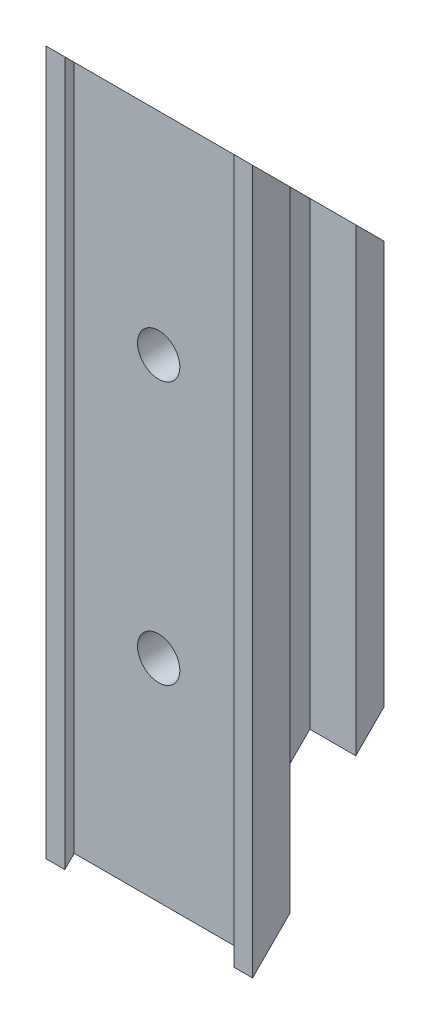
ISO-10303-21;
HEADER;
FILE_DESCRIPTION(('STEP AP214'),'2;1');
FILE_NAME('part.step','',(''),(''),'','','');
FILE_SCHEMA(('AUTOMOTIVE_DESIGN { 1 0 10303 214 1 1 1 1 }'));
ENDSEC;
DATA;
#1=APPLICATION_CONTEXT('core data for automotive mechanical design processes');
#2=APPLICATION_PROTOCOL_DEFINITION('international standard','automotive_design',2000,#1);
#3=PRODUCT_CONTEXT('',#1,'mechanical');
#4=PRODUCT('Part','Part','',(#3));
#5=PRODUCT_RELATED_PRODUCT_CATEGORY('part','',(#4));
#6=PRODUCT_DEFINITION_FORMATION('','',#4);
#7=PRODUCT_DEFINITION_CONTEXT('part definition',#1,'design');
#8=PRODUCT_DEFINITION('design','',#6,#7);
#9=PRODUCT_DEFINITION_SHAPE('','',#8);
#10=(LENGTH_UNIT() NAMED_UNIT(*) SI_UNIT(.MILLI.,.METRE.));
#11=(NAMED_UNIT(*) PLANE_ANGLE_UNIT() SI_UNIT($,.RADIAN.));
#12=(NAMED_UNIT(*) SI_UNIT($,.STERADIAN.) SOLID_ANGLE_UNIT());
#13=UNCERTAINTY_MEASURE_WITH_UNIT(LENGTH_MEASURE(1.E-05),#10,'distance_accuracy_value','');
#14=(GEOMETRIC_REPRESENTATION_CONTEXT(3) GLOBAL_UNCERTAINTY_ASSIGNED_CONTEXT((#13)) GLOBAL_UNIT_ASSIGNED_CONTEXT((#10,
#11,#12)) REPRESENTATION_CONTEXT('',''));
#15=CARTESIAN_POINT('',(0.,0.,0.));
#16=DIRECTION('',(0.,0.,1.));
#17=DIRECTION('',(1.,0.,0.));
#18=AXIS2_PLACEMENT_3D('',#15,#16,#17);
#19=CARTESIAN_POINT('',(9.,37.5,-1.));
#20=DIRECTION('',(1.,0.,0.));
#21=DIRECTION('',(0.,0.,-1.));
#22=AXIS2_PLACEMENT_3D('',#19,#20,#21);
#23=PLANE('',#22);
#24=DIRECTION('',(0.,-1.,0.));
#25=VECTOR('',#24,1.);
#26=CARTESIAN_POINT('',(9.,37.5,-1.));
#27=LINE('',#26,#25);
#28=CARTESIAN_POINT('',(9.,36.4999999999997,-1.));
#29=VERTEX_POINT('',#28);
#30=CARTESIAN_POINT('',(9.,-36.4999999999999,-1.));
#31=VERTEX_POINT('',#30);
#32=EDGE_CURVE('E282',#29,#31,#27,.T.);
#33=ORIENTED_EDGE('',*,*,#32,.T.);
#34=DIRECTION('',(0.,0.707106781186551,-0.707106781186544));
#35=VECTOR('',#34,1.);
#36=CARTESIAN_POINT('',(9.,-19.4999999999997,-18.));
#37=LINE('',#36,#35);
#38=CARTESIAN_POINT('',(9.,-37.5,0.));
#39=VERTEX_POINT('',#38);
#40=EDGE_CURVE('E179',#31,#39,#37,.F.);
#41=ORIENTED_EDGE('',*,*,#40,.T.);
#42=DIRECTION('',(0.,-1.,0.));
#43=VECTOR('',#42,1.);
#44=CARTESIAN_POINT('',(9.,37.5,0.));
#45=LINE('',#44,#43);
#46=CARTESIAN_POINT('',(9.,37.5,0.));
#47=VERTEX_POINT('',#46);
#48=EDGE_CURVE('E186',#47,#39,#45,.T.);
#49=ORIENTED_EDGE('',*,*,#48,.F.);
#50=DIRECTION('',(0.,-0.707106781186544,-0.707106781186551));
#51=VECTOR('',#50,1.);
#52=CARTESIAN_POINT('',(9.,37.5,3.15719672627779E-13));
#53=LINE('',#52,#51);
#54=EDGE_CURVE('E168',#47,#29,#53,.T.);
#55=ORIENTED_EDGE('',*,*,#54,.T.);
#56=EDGE_LOOP('',(#33,#41,#49,#55));
#57=FACE_BOUND('',#56,.T.);
#58=ADVANCED_FACE('F41',(#57),#23,.F.);
#59=CARTESIAN_POINT('',(9.,37.5,0.));
#60=DIRECTION('',(0.,0.,-1.));
#61=DIRECTION('',(-1.,0.,0.));
#62=AXIS2_PLACEMENT_3D('',#59,#60,#61);
#63=PLANE('',#62);
#64=DIRECTION('',(1.,0.,0.));
#65=VECTOR('',#64,1.);
#66=CARTESIAN_POINT('',(9.,-37.5,0.));
#67=LINE('',#66,#65);
#68=CARTESIAN_POINT('',(11.,-37.5,0.));
#69=VERTEX_POINT('',#68);
#70=EDGE_CURVE('E267',#39,#69,#67,.T.);
#71=ORIENTED_EDGE('',*,*,#70,.T.);
#72=DIRECTION('',(0.,-1.,0.));
#73=VECTOR('',#72,1.);
#74=CARTESIAN_POINT('',(11.,37.5,0.));
#75=LINE('',#74,#73);
#76=CARTESIAN_POINT('',(11.,37.5,0.));
#77=VERTEX_POINT('',#76);
#78=EDGE_CURVE('E189',#77,#69,#75,.T.);
#79=ORIENTED_EDGE('',*,*,#78,.F.);
#80=DIRECTION('',(1.,0.,0.));
#81=VECTOR('',#80,1.);
#82=CARTESIAN_POINT('',(9.,37.5,0.));
#83=LINE('',#82,#81);
#84=EDGE_CURVE('E172',#47,#77,#83,.T.);
#85=ORIENTED_EDGE('',*,*,#84,.F.);
#86=ORIENTED_EDGE('',*,*,#48,.T.);
#87=EDGE_LOOP('',(#71,#79,#85,#86));
#88=FACE_BOUND('',#87,.T.);
#89=ADVANCED_FACE('F185',(#88),#63,.F.);
#90=CARTESIAN_POINT('',(11.,37.5,0.));
#91=DIRECTION('',(-1.,0.,0.));
#92=DIRECTION('',(0.,0.,1.));
#93=AXIS2_PLACEMENT_3D('',#90,#91,#92);
#94=PLANE('',#93);
#95=ORIENTED_EDGE('',*,*,#78,.T.);
#96=DIRECTION('',(0.,-0.707106781186551,0.707106781186544));
#97=VECTOR('',#96,1.);
#98=CARTESIAN_POINT('',(11.,-19.4999999999997,-18.));
#99=LINE('',#98,#97);
#100=CARTESIAN_POINT('',(11.,-33.4999999999998,-4.));
#101=VERTEX_POINT('',#100);
#102=EDGE_CURVE('E234',#69,#101,#99,.F.);
#103=ORIENTED_EDGE('',*,*,#102,.T.);
#104=DIRECTION('',(0.,-1.,0.));
#105=VECTOR('',#104,1.);
#106=CARTESIAN_POINT('',(11.,37.5,-4.));
#107=LINE('',#106,#105);
#108=CARTESIAN_POINT('',(11.,33.4999999999997,-4.));
#109=VERTEX_POINT('',#108);
#110=EDGE_CURVE('E198',#109,#101,#107,.T.);
#111=ORIENTED_EDGE('',*,*,#110,.F.);
#112=DIRECTION('',(0.,0.707106781186544,0.707106781186551));
#113=VECTOR('',#112,1.);
#114=CARTESIAN_POINT('',(11.,37.5,3.15719672627779E-13));
#115=LINE('',#114,#113);
#116=EDGE_CURVE('E232',#109,#77,#115,.T.);
#117=ORIENTED_EDGE('',*,*,#116,.T.);
#118=EDGE_LOOP('',(#95,#103,#111,#117));
#119=FACE_BOUND('',#118,.T.);
#120=ADVANCED_FACE('F338',(#119),#94,.F.);
#121=CARTESIAN_POINT('',(11.,37.5,-4.));
#122=DIRECTION('',(0.,0.,1.));
#123=DIRECTION('',(1.,0.,0.));
#124=AXIS2_PLACEMENT_3D('',#121,#122,#123);
#125=PLANE('',#124);
#126=ORIENTED_EDGE('',*,*,#110,.T.);
#127=DIRECTION('',(1.,0.,0.));
#128=VECTOR('',#127,1.);
#129=CARTESIAN_POINT('',(9.,-33.4999999999998,-4.));
#130=LINE('',#129,#128);
#131=CARTESIAN_POINT('',(4.1,-33.4999999999998,-4.));
#132=VERTEX_POINT('',#131);
#133=EDGE_CURVE('E238',#101,#132,#130,.F.);
#134=ORIENTED_EDGE('',*,*,#133,.T.);
#135=DIRECTION('',(0.,-1.,0.));
#136=VECTOR('',#135,1.);
#137=CARTESIAN_POINT('',(4.1,37.5,-4.));
#138=LINE('',#137,#136);
#139=CARTESIAN_POINT('',(4.1,33.4999999999997,-4.));
#140=VERTEX_POINT('',#139);
#141=EDGE_CURVE('E313',#140,#132,#138,.T.);
#142=ORIENTED_EDGE('',*,*,#141,.F.);
#143=DIRECTION('',(1.,0.,0.));
#144=VECTOR('',#143,1.);
#145=CARTESIAN_POINT('',(0.,33.4999999999997,-4.));
#146=LINE('',#145,#144);
#147=EDGE_CURVE('E236',#140,#109,#146,.T.);
#148=ORIENTED_EDGE('',*,*,#147,.T.);
#149=EDGE_LOOP('',(#126,#134,#142,#148));
#150=FACE_BOUND('',#149,.T.);
#151=ADVANCED_FACE('F319',(#150),#125,.F.);
#152=CARTESIAN_POINT('',(4.1,37.5,-4.));
#153=DIRECTION('',(-1.,0.,0.));
#154=DIRECTION('',(0.,0.,1.));
#155=AXIS2_PLACEMENT_3D('',#152,#153,#154);
#156=PLANE('',#155);
#157=ORIENTED_EDGE('',*,*,#141,.T.);
#158=DIRECTION('',(0.,-0.707106781186551,0.707106781186544));
#159=VECTOR('',#158,1.);
#160=CARTESIAN_POINT('',(4.1,-19.4999999999997,-18.));
#161=LINE('',#160,#159);
#162=CARTESIAN_POINT('',(4.1,-24.4999999999997,-13.));
#163=VERTEX_POINT('',#162);
#164=EDGE_CURVE('E242',#132,#163,#161,.F.);
#165=ORIENTED_EDGE('',*,*,#164,.T.);
#166=DIRECTION('',(0.,-1.,0.));
#167=VECTOR('',#166,1.);
#168=CARTESIAN_POINT('',(4.1,37.5,-13.));
#169=LINE('',#168,#167);
#170=CARTESIAN_POINT('',(4.1,24.4999999999998,-13.));
#171=VERTEX_POINT('',#170);
#172=EDGE_CURVE('E310',#171,#163,#169,.T.);
#173=ORIENTED_EDGE('',*,*,#172,.F.);
#174=DIRECTION('',(0.,0.707106781186544,0.707106781186551));
#175=VECTOR('',#174,1.);
#176=CARTESIAN_POINT('',(4.1,37.5,3.15719672627779E-13));
#177=LINE('',#176,#175);
#178=EDGE_CURVE('E240',#171,#140,#177,.T.);
#179=ORIENTED_EDGE('',*,*,#178,.T.);
#180=EDGE_LOOP('',(#157,#165,#173,#179));
#181=FACE_BOUND('',#180,.T.);
#182=ADVANCED_FACE('F332',(#181),#156,.F.);
#183=CARTESIAN_POINT('',(4.1,37.5,-13.));
#184=DIRECTION('',(0.,0.,-1.));
#185=DIRECTION('',(-1.,0.,0.));
#186=AXIS2_PLACEMENT_3D('',#183,#184,#185);
#187=PLANE('',#186);
#188=ORIENTED_EDGE('',*,*,#172,.T.);
#189=DIRECTION('',(-1.,0.,0.));
#190=VECTOR('',#189,1.);
#191=CARTESIAN_POINT('',(9.,-24.4999999999997,-13.));
#192=LINE('',#191,#190);
#193=CARTESIAN_POINT('',(9.,-24.4999999999997,-13.));
#194=VERTEX_POINT('',#193);
#195=EDGE_CURVE('E246',#163,#194,#192,.F.);
#196=ORIENTED_EDGE('',*,*,#195,.T.);
#197=DIRECTION('',(0.,-1.,0.));
#198=VECTOR('',#197,1.);
#199=CARTESIAN_POINT('',(9.,37.5,-13.));
#200=LINE('',#199,#198);
#201=CARTESIAN_POINT('',(9.,24.4999999999998,-13.));
#202=VERTEX_POINT('',#201);
#203=EDGE_CURVE('E307',#202,#194,#200,.T.);
#204=ORIENTED_EDGE('',*,*,#203,.F.);
#205=DIRECTION('',(-1.,0.,0.));
#206=VECTOR('',#205,1.);
#207=CARTESIAN_POINT('',(0.,24.4999999999998,-13.));
#208=LINE('',#207,#206);
#209=EDGE_CURVE('E244',#202,#171,#208,.T.);
#210=ORIENTED_EDGE('',*,*,#209,.T.);
#211=EDGE_LOOP('',(#188,#196,#204,#210));
#212=FACE_BOUND('',#211,.T.);
#213=ADVANCED_FACE('F335',(#212),#187,.F.);
#214=CARTESIAN_POINT('',(9.,37.5,-13.));
#215=DIRECTION('',(-1.,0.,0.));
#216=DIRECTION('',(0.,0.,1.));
#217=AXIS2_PLACEMENT_3D('',#214,#215,#216);
#218=PLANE('',#217);
#219=DIRECTION('',(0.,-0.707106781186551,0.707106781186544));
#220=VECTOR('',#219,1.);
#221=CARTESIAN_POINT('',(9.,-19.4999999999997,-18.));
#222=LINE('',#221,#220);
#223=CARTESIAN_POINT('',(9.,-21.4999999999997,-16.));
#224=VERTEX_POINT('',#223);
#225=EDGE_CURVE('E250',#194,#224,#222,.F.);
#226=ORIENTED_EDGE('',*,*,#225,.T.);
#227=DIRECTION('',(0.,1.,0.));
#228=VECTOR('',#227,1.);
#229=CARTESIAN_POINT('',(9.,37.5,-16.));
#230=LINE('',#229,#228);
#231=CARTESIAN_POINT('',(9.,21.4999999999999,-16.));
#232=VERTEX_POINT('',#231);
#233=EDGE_CURVE('E11',#224,#232,#230,.T.);
#234=ORIENTED_EDGE('',*,*,#233,.T.);
#235=DIRECTION('',(0.,0.707106781186544,0.707106781186551));
#236=VECTOR('',#235,1.);
#237=CARTESIAN_POINT('',(9.,37.5,3.141584214994E-13));
#238=LINE('',#237,#236);
#239=EDGE_CURVE('E248',#232,#202,#238,.T.);
#240=ORIENTED_EDGE('',*,*,#239,.T.);
#241=ORIENTED_EDGE('',*,*,#203,.T.);
#242=EDGE_LOOP('',(#226,#234,#240,#241));
#243=FACE_BOUND('',#242,.T.);
#244=ADVANCED_FACE('F437',(#243),#218,.F.);
#245=CARTESIAN_POINT('',(9.,37.5,-18.));
#246=DIRECTION('',(0.,0.,1.));
#247=DIRECTION('',(1.,0.,0.));
#248=AXIS2_PLACEMENT_3D('',#245,#246,#247);
#249=PLANE('',#248);
#250=CARTESIAN_POINT('',(0.,14.,-18.));
#251=DIRECTION('',(0.,0.,-1.));
#252=DIRECTION('',(-1.,0.,0.));
#253=AXIS2_PLACEMENT_3D('',#250,#251,#252);
#254=CIRCLE('',#253,4.7);
#255=CARTESIAN_POINT('',(-4.7,14.,-18.));
#256=VERTEX_POINT('',#255);
#257=EDGE_CURVE('E559',#256,#256,#254,.T.);
#258=ORIENTED_EDGE('',*,*,#257,.F.);
#259=EDGE_LOOP('',(#258));
#260=FACE_BOUND('',#259,.T.);
#261=CARTESIAN_POINT('',(0.,-14.,-18.));
#262=DIRECTION('',(0.,0.,-1.));
#263=DIRECTION('',(-1.,0.,0.));
#264=AXIS2_PLACEMENT_3D('',#261,#262,#263);
#265=CIRCLE('',#264,4.7);
#266=CARTESIAN_POINT('',(-4.7,-14.,-18.));
#267=VERTEX_POINT('',#266);
#268=EDGE_CURVE('E273',#267,#267,#265,.T.);
#269=ORIENTED_EDGE('',*,*,#268,.F.);
#270=EDGE_LOOP('',(#269));
#271=FACE_BOUND('',#270,.T.);
#272=DIRECTION('',(-1.,0.,0.));
#273=VECTOR('',#272,1.);
#274=CARTESIAN_POINT('',(9.,-19.4999999999997,-18.));
#275=LINE('',#274,#273);
#276=CARTESIAN_POINT('',(7.,-19.4999999999997,-18.));
#277=VERTEX_POINT('',#276);
#278=CARTESIAN_POINT('',(-6.99999999999999,-19.4999999999997,-18.));
#279=VERTEX_POINT('',#278);
#280=EDGE_CURVE('E196',#277,#279,#275,.T.);
#281=ORIENTED_EDGE('',*,*,#280,.T.);
#282=DIRECTION('',(0.,1.,0.));
#283=VECTOR('',#282,1.);
#284=CARTESIAN_POINT('',(-6.99999999999999,37.5,-18.));
#285=LINE('',#284,#283);
#286=CARTESIAN_POINT('',(-6.99999999999999,19.4999999999999,-18.));
#287=VERTEX_POINT('',#286);
#288=EDGE_CURVE('E262',#279,#287,#285,.T.);
#289=ORIENTED_EDGE('',*,*,#288,.T.);
#290=DIRECTION('',(1.,0.,0.));
#291=VECTOR('',#290,1.);
#292=CARTESIAN_POINT('',(9.,19.4999999999999,-18.));
#293=LINE('',#292,#291);
#294=CARTESIAN_POINT('',(7.,19.4999999999999,-18.));
#295=VERTEX_POINT('',#294);
#296=EDGE_CURVE('E194',#287,#295,#293,.T.);
#297=ORIENTED_EDGE('',*,*,#296,.T.);
#298=DIRECTION('',(0.,-1.,0.));
#299=VECTOR('',#298,1.);
#300=CARTESIAN_POINT('',(7.,37.5,-18.));
#301=LINE('',#300,#299);
#302=EDGE_CURVE('E259',#295,#277,#301,.T.);
#303=ORIENTED_EDGE('',*,*,#302,.T.);
#304=EDGE_LOOP('',(#281,#289,#297,#303));
#305=FACE_BOUND('',#304,.T.);
#306=ADVANCED_FACE('F435',(#260,#271,#305),#249,.F.);
#307=CARTESIAN_POINT('',(-9.,37.5,-13.));
#308=DIRECTION('',(1.,0.,0.));
#309=DIRECTION('',(0.,0.,-1.));
#310=AXIS2_PLACEMENT_3D('',#307,#308,#309);
#311=PLANE('',#310);
#312=DIRECTION('',(0.,-0.707106781186544,-0.707106781186551));
#313=VECTOR('',#312,1.);
#314=CARTESIAN_POINT('',(-9.,37.5,3.141584214994E-13));
#315=LINE('',#314,#313);
#316=CARTESIAN_POINT('',(-9.,24.4999999999998,-13.));
#317=VERTEX_POINT('',#316);
#318=CARTESIAN_POINT('',(-9.,21.4999999999999,-16.));
#319=VERTEX_POINT('',#318);
#320=EDGE_CURVE('E204',#317,#319,#315,.T.);
#321=ORIENTED_EDGE('',*,*,#320,.T.);
#322=DIRECTION('',(0.,-1.,0.));
#323=VECTOR('',#322,1.);
#324=CARTESIAN_POINT('',(-9.,37.5,-16.));
#325=LINE('',#324,#323);
#326=CARTESIAN_POINT('',(-9.,-21.4999999999997,-16.));
#327=VERTEX_POINT('',#326);
#328=EDGE_CURVE('E252',#319,#327,#325,.T.);
#329=ORIENTED_EDGE('',*,*,#328,.T.);
#330=DIRECTION('',(0.,0.707106781186551,-0.707106781186544));
#331=VECTOR('',#330,1.);
#332=CARTESIAN_POINT('',(-9.,-19.4999999999997,-18.));
#333=LINE('',#332,#331);
#334=CARTESIAN_POINT('',(-9.,-24.4999999999997,-13.));
#335=VERTEX_POINT('',#334);
#336=EDGE_CURVE('E207',#327,#335,#333,.F.);
#337=ORIENTED_EDGE('',*,*,#336,.T.);
#338=DIRECTION('',(0.,-1.,0.));
#339=VECTOR('',#338,1.);
#340=CARTESIAN_POINT('',(-9.,37.5,-13.));
#341=LINE('',#340,#339);
#342=EDGE_CURVE('E304',#317,#335,#341,.T.);
#343=ORIENTED_EDGE('',*,*,#342,.F.);
#344=EDGE_LOOP('',(#321,#329,#337,#343));
#345=FACE_BOUND('',#344,.T.);
#346=ADVANCED_FACE('F380',(#345),#311,.F.);
#347=CARTESIAN_POINT('',(-4.1,37.5,-13.));
#348=DIRECTION('',(0.,0.,-1.));
#349=DIRECTION('',(-1.,0.,0.));
#350=AXIS2_PLACEMENT_3D('',#347,#348,#349);
#351=PLANE('',#350);
#352=ORIENTED_EDGE('',*,*,#342,.T.);
#353=DIRECTION('',(-1.,0.,0.));
#354=VECTOR('',#353,1.);
#355=CARTESIAN_POINT('',(9.,-24.4999999999997,-13.));
#356=LINE('',#355,#354);
#357=CARTESIAN_POINT('',(-4.1,-24.4999999999997,-13.));
#358=VERTEX_POINT('',#357);
#359=EDGE_CURVE('E211',#335,#358,#356,.F.);
#360=ORIENTED_EDGE('',*,*,#359,.T.);
#361=DIRECTION('',(0.,-1.,0.));
#362=VECTOR('',#361,1.);
#363=CARTESIAN_POINT('',(-4.1,37.5,-13.));
#364=LINE('',#363,#362);
#365=CARTESIAN_POINT('',(-4.1,24.4999999999998,-13.));
#366=VERTEX_POINT('',#365);
#367=EDGE_CURVE('E301',#366,#358,#364,.T.);
#368=ORIENTED_EDGE('',*,*,#367,.F.);
#369=DIRECTION('',(-1.,0.,0.));
#370=VECTOR('',#369,1.);
#371=CARTESIAN_POINT('',(0.,24.4999999999998,-13.));
#372=LINE('',#371,#370);
#373=EDGE_CURVE('E209',#366,#317,#372,.T.);
#374=ORIENTED_EDGE('',*,*,#373,.T.);
#375=EDGE_LOOP('',(#352,#360,#368,#374));
#376=FACE_BOUND('',#375,.T.);
#377=ADVANCED_FACE('F383',(#376),#351,.F.);
#378=CARTESIAN_POINT('',(-4.1,37.5,-4.));
#379=DIRECTION('',(1.,0.,0.));
#380=DIRECTION('',(0.,0.,-1.));
#381=AXIS2_PLACEMENT_3D('',#378,#379,#380);
#382=PLANE('',#381);
#383=ORIENTED_EDGE('',*,*,#367,.T.);
#384=DIRECTION('',(0.,0.707106781186551,-0.707106781186544));
#385=VECTOR('',#384,1.);
#386=CARTESIAN_POINT('',(-4.1,-19.4999999999997,-18.));
#387=LINE('',#386,#385);
#388=CARTESIAN_POINT('',(-4.1,-33.4999999999998,-4.));
#389=VERTEX_POINT('',#388);
#390=EDGE_CURVE('E215',#358,#389,#387,.F.);
#391=ORIENTED_EDGE('',*,*,#390,.T.);
#392=DIRECTION('',(0.,-1.,0.));
#393=VECTOR('',#392,1.);
#394=CARTESIAN_POINT('',(-4.1,37.5,-4.));
#395=LINE('',#394,#393);
#396=CARTESIAN_POINT('',(-4.1,33.4999999999997,-4.));
#397=VERTEX_POINT('',#396);
#398=EDGE_CURVE('E298',#397,#389,#395,.T.);
#399=ORIENTED_EDGE('',*,*,#398,.F.);
#400=DIRECTION('',(0.,-0.707106781186544,-0.707106781186551));
#401=VECTOR('',#400,1.);
#402=CARTESIAN_POINT('',(-4.1,37.5,3.15719672627779E-13));
#403=LINE('',#402,#401);
#404=EDGE_CURVE('E213',#397,#366,#403,.T.);
#405=ORIENTED_EDGE('',*,*,#404,.T.);
#406=EDGE_LOOP('',(#383,#391,#399,#405));
#407=FACE_BOUND('',#406,.T.);
#408=ADVANCED_FACE('F390',(#407),#382,.F.);
#409=CARTESIAN_POINT('',(-11.,37.5,-4.));
#410=DIRECTION('',(0.,0.,1.));
#411=DIRECTION('',(1.,0.,0.));
#412=AXIS2_PLACEMENT_3D('',#409,#410,#411);
#413=PLANE('',#412);
#414=ORIENTED_EDGE('',*,*,#398,.T.);
#415=DIRECTION('',(1.,0.,0.));
#416=VECTOR('',#415,1.);
#417=CARTESIAN_POINT('',(8.99999999999999,-33.4999999999998,-4.));
#418=LINE('',#417,#416);
#419=CARTESIAN_POINT('',(-11.,-33.4999999999998,-4.));
#420=VERTEX_POINT('',#419);
#421=EDGE_CURVE('E219',#389,#420,#418,.F.);
#422=ORIENTED_EDGE('',*,*,#421,.T.);
#423=DIRECTION('',(0.,-1.,0.));
#424=VECTOR('',#423,1.);
#425=CARTESIAN_POINT('',(-11.,37.5,-4.));
#426=LINE('',#425,#424);
#427=CARTESIAN_POINT('',(-11.,33.4999999999997,-4.));
#428=VERTEX_POINT('',#427);
#429=EDGE_CURVE('E295',#428,#420,#426,.T.);
#430=ORIENTED_EDGE('',*,*,#429,.F.);
#431=DIRECTION('',(1.,0.,0.));
#432=VECTOR('',#431,1.);
#433=CARTESIAN_POINT('',(0.,33.4999999999997,-4.));
#434=LINE('',#433,#432);
#435=EDGE_CURVE('E217',#428,#397,#434,.T.);
#436=ORIENTED_EDGE('',*,*,#435,.T.);
#437=EDGE_LOOP('',(#414,#422,#430,#436));
#438=FACE_BOUND('',#437,.T.);
#439=ADVANCED_FACE('F393',(#438),#413,.F.);
#440=CARTESIAN_POINT('',(-11.,37.5,0.));
#441=DIRECTION('',(1.,0.,0.));
#442=DIRECTION('',(0.,0.,-1.));
#443=AXIS2_PLACEMENT_3D('',#440,#441,#442);
#444=PLANE('',#443);
#445=ORIENTED_EDGE('',*,*,#429,.T.);
#446=DIRECTION('',(0.,0.707106781186551,-0.707106781186544));
#447=VECTOR('',#446,1.);
#448=CARTESIAN_POINT('',(-11.,-19.4999999999997,-18.));
#449=LINE('',#448,#447);
#450=CARTESIAN_POINT('',(-11.,-37.5,0.));
#451=VERTEX_POINT('',#450);
#452=EDGE_CURVE('E223',#420,#451,#449,.F.);
#453=ORIENTED_EDGE('',*,*,#452,.T.);
#454=DIRECTION('',(0.,-1.,0.));
#455=VECTOR('',#454,1.);
#456=CARTESIAN_POINT('',(-11.,37.5,0.));
#457=LINE('',#456,#455);
#458=CARTESIAN_POINT('',(-11.,37.5,0.));
#459=VERTEX_POINT('',#458);
#460=EDGE_CURVE('E292',#459,#451,#457,.T.);
#461=ORIENTED_EDGE('',*,*,#460,.F.);
#462=DIRECTION('',(0.,-0.707106781186544,-0.707106781186551));
#463=VECTOR('',#462,1.);
#464=CARTESIAN_POINT('',(-11.,37.5,3.15719672627779E-13));
#465=LINE('',#464,#463);
#466=EDGE_CURVE('E221',#459,#428,#465,.T.);
#467=ORIENTED_EDGE('',*,*,#466,.T.);
#468=EDGE_LOOP('',(#445,#453,#461,#467));
#469=FACE_BOUND('',#468,.T.);
#470=ADVANCED_FACE('F399',(#469),#444,.F.);
#471=CARTESIAN_POINT('',(-9.,37.5,0.));
#472=DIRECTION('',(0.,0.,-1.));
#473=DIRECTION('',(-1.,0.,0.));
#474=AXIS2_PLACEMENT_3D('',#471,#472,#473);
#475=PLANE('',#474);
#476=DIRECTION('',(1.,0.,0.));
#477=VECTOR('',#476,1.);
#478=CARTESIAN_POINT('',(-9.,-37.5,0.));
#479=LINE('',#478,#477);
#480=CARTESIAN_POINT('',(-9.,-37.5,0.));
#481=VERTEX_POINT('',#480);
#482=EDGE_CURVE('E191',#451,#481,#479,.T.);
#483=ORIENTED_EDGE('',*,*,#482,.T.);
#484=DIRECTION('',(0.,-1.,0.));
#485=VECTOR('',#484,1.);
#486=CARTESIAN_POINT('',(-9.,37.5,0.));
#487=LINE('',#486,#485);
#488=CARTESIAN_POINT('',(-9.,37.5,0.));
#489=VERTEX_POINT('',#488);
#490=EDGE_CURVE('E289',#489,#481,#487,.T.);
#491=ORIENTED_EDGE('',*,*,#490,.F.);
#492=DIRECTION('',(1.,0.,0.));
#493=VECTOR('',#492,1.);
#494=CARTESIAN_POINT('',(-9.,37.5,0.));
#495=LINE('',#494,#493);
#496=EDGE_CURVE('E190',#459,#489,#495,.T.);
#497=ORIENTED_EDGE('',*,*,#496,.F.);
#498=ORIENTED_EDGE('',*,*,#460,.T.);
#499=EDGE_LOOP('',(#483,#491,#497,#498));
#500=FACE_BOUND('',#499,.T.);
#501=ADVANCED_FACE('F403',(#500),#475,.F.);
#502=CARTESIAN_POINT('',(-9.,37.5,-1.));
#503=DIRECTION('',(-1.,0.,0.));
#504=DIRECTION('',(0.,0.,1.));
#505=AXIS2_PLACEMENT_3D('',#502,#503,#504);
#506=PLANE('',#505);
#507=ORIENTED_EDGE('',*,*,#490,.T.);
#508=DIRECTION('',(0.,-0.707106781186551,0.707106781186544));
#509=VECTOR('',#508,1.);
#510=CARTESIAN_POINT('',(-9.,-19.4999999999997,-18.));
#511=LINE('',#510,#509);
#512=CARTESIAN_POINT('',(-9.,-36.4999999999999,-1.));
#513=VERTEX_POINT('',#512);
#514=EDGE_CURVE('E227',#481,#513,#511,.F.);
#515=ORIENTED_EDGE('',*,*,#514,.T.);
#516=DIRECTION('',(0.,-1.,0.));
#517=VECTOR('',#516,1.);
#518=CARTESIAN_POINT('',(-9.,37.5,-1.));
#519=LINE('',#518,#517);
#520=CARTESIAN_POINT('',(-9.,36.4999999999997,-1.));
#521=VERTEX_POINT('',#520);
#522=EDGE_CURVE('E286',#521,#513,#519,.T.);
#523=ORIENTED_EDGE('',*,*,#522,.F.);
#524=DIRECTION('',(0.,0.707106781186544,0.707106781186551));
#525=VECTOR('',#524,1.);
#526=CARTESIAN_POINT('',(-9.,37.5,3.15719672627779E-13));
#527=LINE('',#526,#525);
#528=EDGE_CURVE('E225',#521,#489,#527,.T.);
#529=ORIENTED_EDGE('',*,*,#528,.T.);
#530=EDGE_LOOP('',(#507,#515,#523,#529));
#531=FACE_BOUND('',#530,.T.);
#532=ADVANCED_FACE('F406',(#531),#506,.F.);
#533=CARTESIAN_POINT('',(-9.,37.5,-1.));
#534=DIRECTION('',(0.,0.,-1.));
#535=DIRECTION('',(-1.,0.,0.));
#536=AXIS2_PLACEMENT_3D('',#533,#534,#535);
#537=PLANE('',#536);
#538=CARTESIAN_POINT('',(0.,14.,-1.));
#539=DIRECTION('',(0.,0.,-1.));
#540=DIRECTION('',(-1.,0.,0.));
#541=AXIS2_PLACEMENT_3D('',#538,#539,#540);
#542=CIRCLE('',#541,2.25);
#543=CARTESIAN_POINT('',(-2.25,14.,-1.));
#544=VERTEX_POINT('',#543);
#545=EDGE_CURVE('E46',#544,#544,#542,.T.);
#546=ORIENTED_EDGE('',*,*,#545,.T.);
#547=EDGE_LOOP('',(#546));
#548=FACE_BOUND('',#547,.T.);
#549=CARTESIAN_POINT('',(0.,-14.,-1.));
#550=DIRECTION('',(0.,0.,-1.));
#551=DIRECTION('',(-1.,0.,0.));
#552=AXIS2_PLACEMENT_3D('',#549,#550,#551);
#553=CIRCLE('',#552,2.25);
#554=CARTESIAN_POINT('',(-2.25,-14.,-1.));
#555=VERTEX_POINT('',#554);
#556=EDGE_CURVE('E265',#555,#555,#553,.T.);
#557=ORIENTED_EDGE('',*,*,#556,.T.);
#558=EDGE_LOOP('',(#557));
#559=FACE_BOUND('',#558,.T.);
#560=ORIENTED_EDGE('',*,*,#522,.T.);
#561=DIRECTION('',(-1.,0.,0.));
#562=VECTOR('',#561,1.);
#563=CARTESIAN_POINT('',(9.,-36.4999999999999,-1.));
#564=LINE('',#563,#562);
#565=EDGE_CURVE('E180',#513,#31,#564,.F.);
#566=ORIENTED_EDGE('',*,*,#565,.T.);
#567=ORIENTED_EDGE('',*,*,#32,.F.);
#568=DIRECTION('',(-1.,0.,0.));
#569=VECTOR('',#568,1.);
#570=CARTESIAN_POINT('',(0.,36.4999999999997,-1.));
#571=LINE('',#570,#569);
#572=EDGE_CURVE('E174',#29,#521,#571,.T.);
#573=ORIENTED_EDGE('',*,*,#572,.T.);
#574=EDGE_LOOP('',(#560,#566,#567,#573));
#575=FACE_BOUND('',#574,.T.);
#576=ADVANCED_FACE('F358',(#548,#559,#575),#537,.F.);
#577=CARTESIAN_POINT('',(9.,-19.4999999999997,-18.));
#578=DIRECTION('',(0.,0.707106781186544,0.707106781186551));
#579=DIRECTION('',(-1.,0.,0.));
#580=AXIS2_PLACEMENT_3D('',#577,#578,#579);
#581=PLANE('',#580);
#582=ORIENTED_EDGE('',*,*,#336,.F.);
#583=DIRECTION('',(0.577350269189624,0.57735026918963,-0.577350269189623));
#584=VECTOR('',#583,1.);
#585=CARTESIAN_POINT('',(-1.66666666666669,-14.1666666666663,-23.3333333333333));
#586=LINE('',#585,#584);
#587=EDGE_CURVE('E257',#327,#279,#586,.T.);
#588=ORIENTED_EDGE('',*,*,#587,.T.);
#589=ORIENTED_EDGE('',*,*,#280,.F.);
#590=DIRECTION('',(0.577350269189621,-0.577350269189631,0.577350269189625));
#591=VECTOR('',#590,1.);
#592=CARTESIAN_POINT('',(7.66666666666666,-20.1666666666664,-17.3333333333333));
#593=LINE('',#592,#591);
#594=EDGE_CURVE('E255',#277,#224,#593,.T.);
#595=ORIENTED_EDGE('',*,*,#594,.T.);
#596=ORIENTED_EDGE('',*,*,#225,.F.);
#597=ORIENTED_EDGE('',*,*,#195,.F.);
#598=ORIENTED_EDGE('',*,*,#164,.F.);
#599=ORIENTED_EDGE('',*,*,#133,.F.);
#600=ORIENTED_EDGE('',*,*,#102,.F.);
#601=ORIENTED_EDGE('',*,*,#70,.F.);
#602=ORIENTED_EDGE('',*,*,#40,.F.);
#603=ORIENTED_EDGE('',*,*,#565,.F.);
#604=ORIENTED_EDGE('',*,*,#514,.F.);
#605=ORIENTED_EDGE('',*,*,#482,.F.);
#606=ORIENTED_EDGE('',*,*,#452,.F.);
#607=ORIENTED_EDGE('',*,*,#421,.F.);
#608=ORIENTED_EDGE('',*,*,#390,.F.);
#609=ORIENTED_EDGE('',*,*,#359,.F.);
#610=EDGE_LOOP('',(#582,#588,#589,#595,#596,#597,#598,#599,#600,#601,#602,#603,#604,#605,#606,
#607,#608,#609));
#611=FACE_BOUND('',#610,.T.);
#612=ADVANCED_FACE('F327',(#611),#581,.F.);
#613=CARTESIAN_POINT('',(0.,37.5,3.15719672627779E-13));
#614=DIRECTION('',(0.,0.707106781186551,-0.707106781186544));
#615=DIRECTION('',(1.,0.,0.));
#616=AXIS2_PLACEMENT_3D('',#613,#614,#615);
#617=PLANE('',#616);
#618=ORIENTED_EDGE('',*,*,#296,.F.);
#619=DIRECTION('',(0.577350269189628,-0.577350269189621,-0.577350269189627));
#620=VECTOR('',#619,1.);
#621=CARTESIAN_POINT('',(-16.6666666666668,29.1666666666666,-8.33333333333319));
#622=LINE('',#621,#620);
#623=EDGE_CURVE('E51',#287,#319,#622,.F.);
#624=ORIENTED_EDGE('',*,*,#623,.T.);
#625=ORIENTED_EDGE('',*,*,#320,.F.);
#626=ORIENTED_EDGE('',*,*,#373,.F.);
#627=ORIENTED_EDGE('',*,*,#404,.F.);
#628=ORIENTED_EDGE('',*,*,#435,.F.);
#629=ORIENTED_EDGE('',*,*,#466,.F.);
#630=ORIENTED_EDGE('',*,*,#496,.T.);
#631=ORIENTED_EDGE('',*,*,#528,.F.);
#632=ORIENTED_EDGE('',*,*,#572,.F.);
#633=ORIENTED_EDGE('',*,*,#54,.F.);
#634=ORIENTED_EDGE('',*,*,#84,.T.);
#635=ORIENTED_EDGE('',*,*,#116,.F.);
#636=ORIENTED_EDGE('',*,*,#147,.F.);
#637=ORIENTED_EDGE('',*,*,#178,.F.);
#638=ORIENTED_EDGE('',*,*,#209,.F.);
#639=ORIENTED_EDGE('',*,*,#239,.F.);
#640=DIRECTION('',(0.577350269189625,0.577350269189623,0.577350269189629));
#641=VECTOR('',#640,1.);
#642=CARTESIAN_POINT('',(16.6666666666668,29.1666666666667,-8.33333333333312));
#643=LINE('',#642,#641);
#644=EDGE_CURVE('E64',#232,#295,#643,.F.);
#645=ORIENTED_EDGE('',*,*,#644,.T.);
#646=EDGE_LOOP('',(#618,#624,#625,#626,#627,#628,#629,#630,#631,#632,#633,#634,#635,#636,#637,
#638,#639,#645));
#647=FACE_BOUND('',#646,.T.);
#648=ADVANCED_FACE('F170',(#647),#617,.T.);
#649=CARTESIAN_POINT('',(-9.,37.5,-16.));
#650=DIRECTION('',(0.707106781186547,0.,0.707106781186548));
#651=DIRECTION('',(0.,-1.,0.));
#652=AXIS2_PLACEMENT_3D('',#649,#650,#651);
#653=PLANE('',#652);
#654=ORIENTED_EDGE('',*,*,#623,.F.);
#655=ORIENTED_EDGE('',*,*,#288,.F.);
#656=ORIENTED_EDGE('',*,*,#587,.F.);
#657=ORIENTED_EDGE('',*,*,#328,.F.);
#658=EDGE_LOOP('',(#654,#655,#656,#657));
#659=FACE_BOUND('',#658,.T.);
#660=ADVANCED_FACE('F363',(#659),#653,.F.);
#661=CARTESIAN_POINT('',(7.,37.5,-18.));
#662=DIRECTION('',(-0.70710678118655,0.,0.707106781186545));
#663=DIRECTION('',(0.,-1.,0.));
#664=AXIS2_PLACEMENT_3D('',#661,#662,#663);
#665=PLANE('',#664);
#666=ORIENTED_EDGE('',*,*,#644,.F.);
#667=ORIENTED_EDGE('',*,*,#233,.F.);
#668=ORIENTED_EDGE('',*,*,#594,.F.);
#669=ORIENTED_EDGE('',*,*,#302,.F.);
#670=EDGE_LOOP('',(#666,#667,#668,#669));
#671=FACE_BOUND('',#670,.T.);
#672=ADVANCED_FACE('F44',(#671),#665,.F.);
#673=CARTESIAN_POINT('',(0.,-14.,-18.));
#674=DIRECTION('',(0.,0.,-1.));
#675=DIRECTION('',(-1.,0.,0.));
#676=AXIS2_PLACEMENT_3D('',#673,#674,#675);
#677=CYLINDRICAL_SURFACE('',#676,2.25);
#678=CARTESIAN_POINT('',(0.,-14.,-15.55));
#679=DIRECTION('',(0.,0.,-1.));
#680=DIRECTION('',(-1.,0.,0.));
#681=AXIS2_PLACEMENT_3D('',#678,#679,#680);
#682=CIRCLE('',#681,2.25);
#683=CARTESIAN_POINT('',(-2.25,-14.,-15.55));
#684=VERTEX_POINT('',#683);
#685=EDGE_CURVE('E268',#684,#684,#682,.T.);
#686=ORIENTED_EDGE('',*,*,#685,.T.);
#687=EDGE_LOOP('',(#686));
#688=FACE_BOUND('',#687,.T.);
#689=ORIENTED_EDGE('',*,*,#556,.F.);
#690=EDGE_LOOP('',(#689));
#691=FACE_BOUND('',#690,.T.);
#692=ADVANCED_FACE('F371',(#688,#691),#677,.F.);
#693=CARTESIAN_POINT('',(0.,-14.,-18.));
#694=DIRECTION('',(0.,0.,-1.));
#695=DIRECTION('',(-1.,0.,0.));
#696=AXIS2_PLACEMENT_3D('',#693,#694,#695);
#697=CONICAL_SURFACE('',#696,4.7,0.785398163397449);
#698=ORIENTED_EDGE('',*,*,#685,.F.);
#699=EDGE_LOOP('',(#698));
#700=FACE_BOUND('',#699,.T.);
#701=ORIENTED_EDGE('',*,*,#268,.T.);
#702=EDGE_LOOP('',(#701));
#703=FACE_BOUND('',#702,.T.);
#704=ADVANCED_FACE('F523',(#700,#703),#697,.F.);
#705=CARTESIAN_POINT('',(0.,14.,-18.));
#706=DIRECTION('',(0.,0.,-1.));
#707=DIRECTION('',(-1.,0.,0.));
#708=AXIS2_PLACEMENT_3D('',#705,#706,#707);
#709=CYLINDRICAL_SURFACE('',#708,2.25);
#710=CARTESIAN_POINT('',(0.,14.,-15.55));
#711=DIRECTION('',(0.,0.,-1.));
#712=DIRECTION('',(-1.,0.,0.));
#713=AXIS2_PLACEMENT_3D('',#710,#711,#712);
#714=CIRCLE('',#713,2.25);
#715=CARTESIAN_POINT('',(-2.25,14.,-15.55));
#716=VERTEX_POINT('',#715);
#717=EDGE_CURVE('E556',#716,#716,#714,.T.);
#718=ORIENTED_EDGE('',*,*,#717,.T.);
#719=EDGE_LOOP('',(#718));
#720=FACE_BOUND('',#719,.T.);
#721=ORIENTED_EDGE('',*,*,#545,.F.);
#722=EDGE_LOOP('',(#721));
#723=FACE_BOUND('',#722,.T.);
#724=ADVANCED_FACE('F531',(#720,#723),#709,.F.);
#725=CARTESIAN_POINT('',(0.,14.,-18.));
#726=DIRECTION('',(0.,0.,-1.));
#727=DIRECTION('',(-1.,0.,0.));
#728=AXIS2_PLACEMENT_3D('',#725,#726,#727);
#729=CONICAL_SURFACE('',#728,4.7,0.785398163397449);
#730=ORIENTED_EDGE('',*,*,#717,.F.);
#731=EDGE_LOOP('',(#730));
#732=FACE_BOUND('',#731,.T.);
#733=ORIENTED_EDGE('',*,*,#257,.T.);
#734=EDGE_LOOP('',(#733));
#735=FACE_BOUND('',#734,.T.);
#736=ADVANCED_FACE('F540',(#732,#735),#729,.F.);
#737=CLOSED_SHELL('',(#58,#89,#120,#151,#182,#213,#244,#306,#346,#377,#408,#439,#470,#501,#532,
#576,#612,#648,#660,#672,#692,#704,#724,#736));
#738=MANIFOLD_SOLID_BREP('B2',#737);
#739=ADVANCED_BREP_SHAPE_REPRESENTATION('',(#18,#738),#14);
#740=SHAPE_DEFINITION_REPRESENTATION(#9,#739);
ENDSEC;
END-ISO-10303-21;
